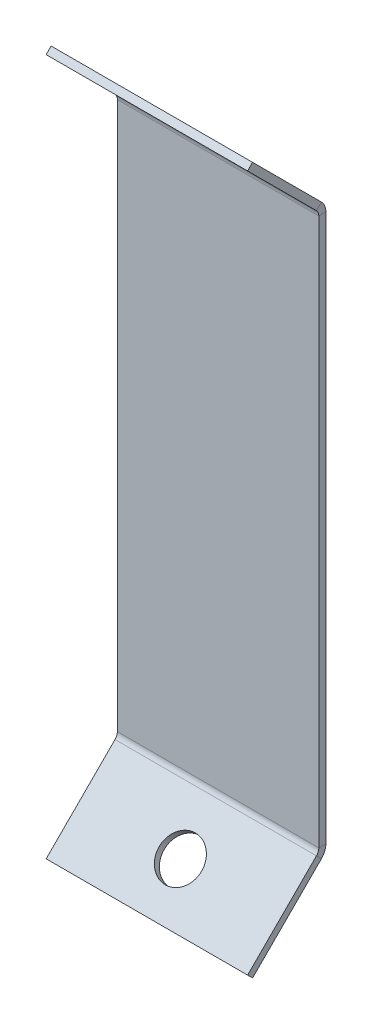
ISO-10303-21;
HEADER;
FILE_DESCRIPTION(('STEP AP214'),'2;1');
FILE_NAME('part.step','',(''),(''),'','','');
FILE_SCHEMA(('AUTOMOTIVE_DESIGN { 1 0 10303 214 1 1 1 1 }'));
ENDSEC;
DATA;
#1=APPLICATION_CONTEXT('core data for automotive mechanical design processes');
#2=APPLICATION_PROTOCOL_DEFINITION('international standard','automotive_design',2000,#1);
#3=PRODUCT_CONTEXT('',#1,'mechanical');
#4=PRODUCT('Part','Part','',(#3));
#5=PRODUCT_RELATED_PRODUCT_CATEGORY('part','',(#4));
#6=PRODUCT_DEFINITION_FORMATION('','',#4);
#7=PRODUCT_DEFINITION_CONTEXT('part definition',#1,'design');
#8=PRODUCT_DEFINITION('design','',#6,#7);
#9=PRODUCT_DEFINITION_SHAPE('','',#8);
#10=(LENGTH_UNIT() NAMED_UNIT(*) SI_UNIT(.MILLI.,.METRE.));
#11=(NAMED_UNIT(*) PLANE_ANGLE_UNIT() SI_UNIT($,.RADIAN.));
#12=(NAMED_UNIT(*) SI_UNIT($,.STERADIAN.) SOLID_ANGLE_UNIT());
#13=UNCERTAINTY_MEASURE_WITH_UNIT(LENGTH_MEASURE(1.E-05),#10,'distance_accuracy_value','');
#14=(GEOMETRIC_REPRESENTATION_CONTEXT(3) GLOBAL_UNCERTAINTY_ASSIGNED_CONTEXT((#13)) GLOBAL_UNIT_ASSIGNED_CONTEXT((#10,
#11,#12)) REPRESENTATION_CONTEXT('',''));
#15=CARTESIAN_POINT('',(0.,0.,0.));
#16=DIRECTION('',(0.,0.,1.));
#17=DIRECTION('',(1.,0.,0.));
#18=AXIS2_PLACEMENT_3D('',#15,#16,#17);
#19=CARTESIAN_POINT('',(0.,0.,-0.7));
#20=DIRECTION('',(0.,0.,-1.));
#21=DIRECTION('',(-1.,0.,0.));
#22=AXIS2_PLACEMENT_3D('',#19,#20,#21);
#23=PLANE('',#22);
#24=DIRECTION('',(0.,-1.,0.));
#25=VECTOR('',#24,1.);
#26=CARTESIAN_POINT('',(-10.,27.5,-0.7));
#27=LINE('',#26,#25);
#28=CARTESIAN_POINT('',(-10.,27.1686291501015,-0.699999999999997));
#29=VERTEX_POINT('',#28);
#30=CARTESIAN_POINT('',(-10.,-27.1686291501015,-0.7));
#31=VERTEX_POINT('',#30);
#32=EDGE_CURVE('E11',#29,#31,#27,.T.);
#33=ORIENTED_EDGE('',*,*,#32,.F.);
#34=DIRECTION('',(-1.,0.,0.));
#35=VECTOR('',#34,1.);
#36=CARTESIAN_POINT('',(-10.,27.1686291501015,-0.699999999999997));
#37=LINE('',#36,#35);
#38=CARTESIAN_POINT('',(9.99999999999999,27.1686291501015,-0.7));
#39=VERTEX_POINT('',#38);
#40=EDGE_CURVE('E203',#29,#39,#37,.F.);
#41=ORIENTED_EDGE('',*,*,#40,.T.);
#42=DIRECTION('',(0.,1.,0.));
#43=VECTOR('',#42,1.);
#44=CARTESIAN_POINT('',(10.,27.5,-0.7));
#45=LINE('',#44,#43);
#46=CARTESIAN_POINT('',(10.,-27.1686291501015,-0.7));
#47=VERTEX_POINT('',#46);
#48=EDGE_CURVE('E46',#47,#39,#45,.T.);
#49=ORIENTED_EDGE('',*,*,#48,.F.);
#50=DIRECTION('',(1.,0.,0.));
#51=VECTOR('',#50,1.);
#52=CARTESIAN_POINT('',(10.,-27.1686291501015,-0.7));
#53=LINE('',#52,#51);
#54=EDGE_CURVE('E60',#47,#31,#53,.F.);
#55=ORIENTED_EDGE('',*,*,#54,.T.);
#56=EDGE_LOOP('',(#33,#41,#49,#55));
#57=FACE_BOUND('',#56,.T.);
#58=ADVANCED_FACE('F37',(#57),#23,.T.);
#59=CARTESIAN_POINT('',(0.,0.,0.));
#60=DIRECTION('',(0.,0.,-1.));
#61=DIRECTION('',(-1.,0.,0.));
#62=AXIS2_PLACEMENT_3D('',#59,#60,#61);
#63=PLANE('',#62);
#64=DIRECTION('',(-1.,0.,0.));
#65=VECTOR('',#64,1.);
#66=CARTESIAN_POINT('',(-10.,27.1686291501015,0.));
#67=LINE('',#66,#65);
#68=CARTESIAN_POINT('',(-10.,27.1686291501015,0.));
#69=VERTEX_POINT('',#68);
#70=CARTESIAN_POINT('',(9.99999999999999,27.1686291501015,0.));
#71=VERTEX_POINT('',#70);
#72=EDGE_CURVE('E216',#69,#71,#67,.F.);
#73=ORIENTED_EDGE('',*,*,#72,.F.);
#74=DIRECTION('',(0.,-1.,0.));
#75=VECTOR('',#74,1.);
#76=CARTESIAN_POINT('',(-10.,27.5,0.));
#77=LINE('',#76,#75);
#78=CARTESIAN_POINT('',(-9.99999999999999,-27.1686291501015,0.));
#79=VERTEX_POINT('',#78);
#80=EDGE_CURVE('E149',#69,#79,#77,.T.);
#81=ORIENTED_EDGE('',*,*,#80,.T.);
#82=DIRECTION('',(1.,0.,0.));
#83=VECTOR('',#82,1.);
#84=CARTESIAN_POINT('',(10.,-27.1686291501015,0.));
#85=LINE('',#84,#83);
#86=CARTESIAN_POINT('',(10.,-27.1686291501015,0.));
#87=VERTEX_POINT('',#86);
#88=EDGE_CURVE('E104',#87,#79,#85,.F.);
#89=ORIENTED_EDGE('',*,*,#88,.F.);
#90=DIRECTION('',(0.,1.,0.));
#91=VECTOR('',#90,1.);
#92=CARTESIAN_POINT('',(10.,27.5,0.));
#93=LINE('',#92,#91);
#94=EDGE_CURVE('E146',#87,#71,#93,.T.);
#95=ORIENTED_EDGE('',*,*,#94,.T.);
#96=EDGE_LOOP('',(#73,#81,#89,#95));
#97=FACE_BOUND('',#96,.T.);
#98=ADVANCED_FACE('F325',(#97),#63,.F.);
#99=CARTESIAN_POINT('',(-10.,27.5,-0.7));
#100=DIRECTION('',(-1.,0.,0.));
#101=DIRECTION('',(0.,-1.,0.));
#102=AXIS2_PLACEMENT_3D('',#99,#100,#101);
#103=PLANE('',#102);
#104=ORIENTED_EDGE('',*,*,#80,.F.);
#105=DIRECTION('',(0.,0.,-1.));
#106=VECTOR('',#105,1.);
#107=CARTESIAN_POINT('',(-10.,27.1686291501015,0.));
#108=LINE('',#107,#106);
#109=EDGE_CURVE('E210',#69,#29,#108,.T.);
#110=ORIENTED_EDGE('',*,*,#109,.T.);
#111=ORIENTED_EDGE('',*,*,#32,.T.);
#112=DIRECTION('',(0.,0.,-1.));
#113=VECTOR('',#112,1.);
#114=CARTESIAN_POINT('',(-9.99999999999999,-27.1686291501015,0.));
#115=LINE('',#114,#113);
#116=EDGE_CURVE('E143',#79,#31,#115,.T.);
#117=ORIENTED_EDGE('',*,*,#116,.F.);
#118=EDGE_LOOP('',(#104,#110,#111,#117));
#119=FACE_BOUND('',#118,.T.);
#120=ADVANCED_FACE('F331',(#119),#103,.T.);
#121=CARTESIAN_POINT('',(10.,27.5,-0.7));
#122=DIRECTION('',(1.,0.,0.));
#123=DIRECTION('',(0.,1.,0.));
#124=AXIS2_PLACEMENT_3D('',#121,#122,#123);
#125=PLANE('',#124);
#126=DIRECTION('',(0.,0.,-1.));
#127=VECTOR('',#126,1.);
#128=CARTESIAN_POINT('',(9.99999999999999,27.1686291501015,0.));
#129=LINE('',#128,#127);
#130=EDGE_CURVE('E221',#71,#39,#129,.T.);
#131=ORIENTED_EDGE('',*,*,#130,.F.);
#132=ORIENTED_EDGE('',*,*,#94,.F.);
#133=DIRECTION('',(0.,0.,-1.));
#134=VECTOR('',#133,1.);
#135=CARTESIAN_POINT('',(10.,-27.1686291501015,0.));
#136=LINE('',#135,#134);
#137=EDGE_CURVE('E103',#87,#47,#136,.T.);
#138=ORIENTED_EDGE('',*,*,#137,.T.);
#139=ORIENTED_EDGE('',*,*,#48,.T.);
#140=EDGE_LOOP('',(#131,#132,#138,#139));
#141=FACE_BOUND('',#140,.T.);
#142=ADVANCED_FACE('F39',(#141),#125,.T.);
#143=CARTESIAN_POINT('',(-9.99999999999999,-27.1686291501015,0.800000000000001));
#144=DIRECTION('',(-1.,0.,0.));
#145=DIRECTION('',(0.,0.,1.));
#146=AXIS2_PLACEMENT_3D('',#143,#144,#145);
#147=PLANE('',#146);
#148=DIRECTION('',(0.,-0.707106781186544,-0.707106781186551));
#149=VECTOR('',#148,1.);
#150=CARTESIAN_POINT('',(-10.,-27.7343145750508,0.23431457505076));
#151=LINE('',#150,#149);
#152=CARTESIAN_POINT('',(-9.99999999999999,-27.7343145750508,0.234314575050759));
#153=VERTEX_POINT('',#152);
#154=CARTESIAN_POINT('',(-9.99999999999999,-28.2292893218813,-0.260660171779827));
#155=VERTEX_POINT('',#154);
#156=EDGE_CURVE('E94',#153,#155,#151,.T.);
#157=ORIENTED_EDGE('',*,*,#156,.F.);
#158=CARTESIAN_POINT('',(-9.99999999999999,-27.1686291501015,0.800000000000001));
#159=DIRECTION('',(1.,0.,0.));
#160=DIRECTION('',(0.,0.,-1.));
#161=AXIS2_PLACEMENT_3D('',#158,#159,#160);
#162=CIRCLE('',#161,0.800000000000001);
#163=EDGE_CURVE('E88',#79,#153,#162,.F.);
#164=ORIENTED_EDGE('',*,*,#163,.F.);
#165=ORIENTED_EDGE('',*,*,#116,.T.);
#166=CARTESIAN_POINT('',(-9.99999999999999,-27.1686291501015,0.800000000000001));
#167=DIRECTION('',(1.,0.,0.));
#168=DIRECTION('',(0.,0.,-1.));
#169=AXIS2_PLACEMENT_3D('',#166,#167,#168);
#170=CIRCLE('',#169,1.5);
#171=EDGE_CURVE('E136',#31,#155,#170,.F.);
#172=ORIENTED_EDGE('',*,*,#171,.T.);
#173=EDGE_LOOP('',(#157,#164,#165,#172));
#174=FACE_BOUND('',#173,.T.);
#175=ADVANCED_FACE('F244',(#174),#147,.T.);
#176=CARTESIAN_POINT('',(10.,-27.1686291501015,0.800000000000001));
#177=DIRECTION('',(-1.,0.,0.));
#178=DIRECTION('',(0.,0.,1.));
#179=AXIS2_PLACEMENT_3D('',#176,#177,#178);
#180=PLANE('',#179);
#181=CARTESIAN_POINT('',(10.,-27.1686291501015,0.800000000000001));
#182=DIRECTION('',(1.,0.,0.));
#183=DIRECTION('',(0.,0.,-1.));
#184=AXIS2_PLACEMENT_3D('',#181,#182,#183);
#185=CIRCLE('',#184,0.800000000000001);
#186=CARTESIAN_POINT('',(10.,-27.7343145750508,0.234314575050759));
#187=VERTEX_POINT('',#186);
#188=EDGE_CURVE('E85',#187,#87,#185,.T.);
#189=ORIENTED_EDGE('',*,*,#188,.F.);
#190=DIRECTION('',(0.,-0.707106781186544,-0.707106781186551));
#191=VECTOR('',#190,1.);
#192=CARTESIAN_POINT('',(10.,-27.7343145750508,0.23431457505076));
#193=LINE('',#192,#191);
#194=CARTESIAN_POINT('',(10.,-28.2292893218813,-0.260660171779825));
#195=VERTEX_POINT('',#194);
#196=EDGE_CURVE('E93',#187,#195,#193,.T.);
#197=ORIENTED_EDGE('',*,*,#196,.T.);
#198=CARTESIAN_POINT('',(10.,-27.1686291501015,0.800000000000001));
#199=DIRECTION('',(1.,0.,0.));
#200=DIRECTION('',(0.,0.,-1.));
#201=AXIS2_PLACEMENT_3D('',#198,#199,#200);
#202=CIRCLE('',#201,1.5);
#203=EDGE_CURVE('E137',#195,#47,#202,.T.);
#204=ORIENTED_EDGE('',*,*,#203,.T.);
#205=ORIENTED_EDGE('',*,*,#137,.F.);
#206=EDGE_LOOP('',(#189,#197,#204,#205));
#207=FACE_BOUND('',#206,.T.);
#208=ADVANCED_FACE('F99',(#207),#180,.F.);
#209=CARTESIAN_POINT('',(10.,-27.1686291501015,0.800000000000001));
#210=DIRECTION('',(1.,0.,0.));
#211=DIRECTION('',(0.,-0.707106781186544,-0.707106781186551));
#212=AXIS2_PLACEMENT_3D('',#209,#210,#211);
#213=CYLINDRICAL_SURFACE('',#212,1.5);
#214=ORIENTED_EDGE('',*,*,#54,.F.);
#215=ORIENTED_EDGE('',*,*,#203,.F.);
#216=DIRECTION('',(-1.,0.,0.));
#217=VECTOR('',#216,1.);
#218=CARTESIAN_POINT('',(0.,-28.2292893218813,-0.260660171779822));
#219=LINE('',#218,#217);
#220=EDGE_CURVE('E117',#195,#155,#219,.T.);
#221=ORIENTED_EDGE('',*,*,#220,.T.);
#222=ORIENTED_EDGE('',*,*,#171,.F.);
#223=EDGE_LOOP('',(#214,#215,#221,#222));
#224=FACE_BOUND('',#223,.T.);
#225=ADVANCED_FACE('F245',(#224),#213,.T.);
#226=CARTESIAN_POINT('',(10.,-27.1686291501015,0.800000000000001));
#227=DIRECTION('',(1.,0.,0.));
#228=DIRECTION('',(0.,-0.707106781186544,-0.707106781186551));
#229=AXIS2_PLACEMENT_3D('',#226,#227,#228);
#230=CYLINDRICAL_SURFACE('',#229,0.800000000000001);
#231=ORIENTED_EDGE('',*,*,#88,.T.);
#232=ORIENTED_EDGE('',*,*,#163,.T.);
#233=DIRECTION('',(1.,0.,0.));
#234=VECTOR('',#233,1.);
#235=CARTESIAN_POINT('',(-10.,-27.7343145750508,0.23431457505076));
#236=LINE('',#235,#234);
#237=EDGE_CURVE('E81',#153,#187,#236,.T.);
#238=ORIENTED_EDGE('',*,*,#237,.T.);
#239=ORIENTED_EDGE('',*,*,#188,.T.);
#240=EDGE_LOOP('',(#231,#232,#238,#239));
#241=FACE_BOUND('',#240,.T.);
#242=ADVANCED_FACE('F84',(#241),#230,.F.);
#243=CARTESIAN_POINT('',(-10.,-27.9949747468306,-0.494974746830586));
#244=DIRECTION('',(1.,0.,0.));
#245=DIRECTION('',(0.,0.,-1.));
#246=AXIS2_PLACEMENT_3D('',#243,#244,#245);
#247=PLANE('',#246);
#248=ORIENTED_EDGE('',*,*,#156,.T.);
#249=DIRECTION('',(0.,0.707106781186551,-0.707106781186544));
#250=VECTOR('',#249,1.);
#251=CARTESIAN_POINT('',(-10.,-27.9949747468306,-0.494974746830586));
#252=LINE('',#251,#250);
#253=CARTESIAN_POINT('',(-10.,-35.0660425586961,6.57609306503485));
#254=VERTEX_POINT('',#253);
#255=EDGE_CURVE('E125',#254,#155,#252,.T.);
#256=ORIENTED_EDGE('',*,*,#255,.F.);
#257=DIRECTION('',(0.,0.707106781186544,0.707106781186551));
#258=VECTOR('',#257,1.);
#259=CARTESIAN_POINT('',(-10.,-35.0660425586961,6.57609306503485));
#260=LINE('',#259,#258);
#261=CARTESIAN_POINT('',(-10.,-34.5710678118655,7.07106781186544));
#262=VERTEX_POINT('',#261);
#263=EDGE_CURVE('E130',#254,#262,#260,.T.);
#264=ORIENTED_EDGE('',*,*,#263,.T.);
#265=DIRECTION('',(0.,0.707106781186551,-0.707106781186544));
#266=VECTOR('',#265,1.);
#267=CARTESIAN_POINT('',(-10.,-27.5,0.));
#268=LINE('',#267,#266);
#269=EDGE_CURVE('E123',#262,#153,#268,.T.);
#270=ORIENTED_EDGE('',*,*,#269,.T.);
#271=EDGE_LOOP('',(#248,#256,#264,#270));
#272=FACE_BOUND('',#271,.T.);
#273=ADVANCED_FACE('F242',(#272),#247,.F.);
#274=CARTESIAN_POINT('',(10.,-35.0660425586961,6.57609306503485));
#275=DIRECTION('',(-1.,0.,0.));
#276=DIRECTION('',(0.,0.,1.));
#277=AXIS2_PLACEMENT_3D('',#274,#275,#276);
#278=PLANE('',#277);
#279=ORIENTED_EDGE('',*,*,#196,.F.);
#280=DIRECTION('',(0.,-0.707106781186551,0.707106781186544));
#281=VECTOR('',#280,1.);
#282=CARTESIAN_POINT('',(10.,-34.5710678118655,7.07106781186544));
#283=LINE('',#282,#281);
#284=CARTESIAN_POINT('',(10.,-34.5710678118655,7.07106781186544));
#285=VERTEX_POINT('',#284);
#286=EDGE_CURVE('E113',#187,#285,#283,.T.);
#287=ORIENTED_EDGE('',*,*,#286,.T.);
#288=DIRECTION('',(0.,0.707106781186544,0.707106781186551));
#289=VECTOR('',#288,1.);
#290=CARTESIAN_POINT('',(10.,-35.0660425586961,6.57609306503485));
#291=LINE('',#290,#289);
#292=CARTESIAN_POINT('',(10.,-35.0660425586961,6.57609306503485));
#293=VERTEX_POINT('',#292);
#294=EDGE_CURVE('E105',#293,#285,#291,.T.);
#295=ORIENTED_EDGE('',*,*,#294,.F.);
#296=DIRECTION('',(0.,-0.707106781186551,0.707106781186544));
#297=VECTOR('',#296,1.);
#298=CARTESIAN_POINT('',(10.,-35.0660425586961,6.57609306503485));
#299=LINE('',#298,#297);
#300=EDGE_CURVE('E116',#195,#293,#299,.T.);
#301=ORIENTED_EDGE('',*,*,#300,.F.);
#302=EDGE_LOOP('',(#279,#287,#295,#301));
#303=FACE_BOUND('',#302,.T.);
#304=ADVANCED_FACE('F110',(#303),#278,.F.);
#305=CARTESIAN_POINT('',(0.,-14.2449747468304,-14.2449747468306));
#306=DIRECTION('',(0.,0.707106781186544,0.707106781186551));
#307=DIRECTION('',(0.,-0.707106781186551,0.707106781186544));
#308=AXIS2_PLACEMENT_3D('',#305,#306,#307);
#309=PLANE('',#308);
#310=CARTESIAN_POINT('',(0.,-31.7379292135304,3.2479797198692));
#311=DIRECTION('',(0.,0.707106781186544,0.707106781186551));
#312=DIRECTION('',(0.,-0.707106781186551,0.707106781186544));
#313=AXIS2_PLACEMENT_3D('',#310,#311,#312);
#314=CIRCLE('',#313,2.1082);
#315=CARTESIAN_POINT('',(0.,-33.2286517296279,4.73870223596667));
#316=VERTEX_POINT('',#315);
#317=EDGE_CURVE('E153',#316,#316,#314,.T.);
#318=ORIENTED_EDGE('',*,*,#317,.T.);
#319=EDGE_LOOP('',(#318));
#320=FACE_BOUND('',#319,.T.);
#321=ORIENTED_EDGE('',*,*,#220,.F.);
#322=ORIENTED_EDGE('',*,*,#300,.T.);
#323=DIRECTION('',(-1.,0.,0.));
#324=VECTOR('',#323,1.);
#325=CARTESIAN_POINT('',(-10.,-35.0660425586961,6.57609306503485));
#326=LINE('',#325,#324);
#327=EDGE_CURVE('E133',#293,#254,#326,.T.);
#328=ORIENTED_EDGE('',*,*,#327,.T.);
#329=ORIENTED_EDGE('',*,*,#255,.T.);
#330=EDGE_LOOP('',(#321,#322,#328,#329));
#331=FACE_BOUND('',#330,.T.);
#332=ADVANCED_FACE('F234',(#320,#331),#309,.F.);
#333=CARTESIAN_POINT('',(0.,-13.7499999999999,-13.75));
#334=DIRECTION('',(0.,0.707106781186544,0.707106781186551));
#335=DIRECTION('',(0.,-0.707106781186551,0.707106781186544));
#336=AXIS2_PLACEMENT_3D('',#333,#334,#335);
#337=PLANE('',#336);
#338=CARTESIAN_POINT('',(0.,-31.2429544666998,3.74295446669978));
#339=DIRECTION('',(0.,0.707106781186544,0.707106781186551));
#340=DIRECTION('',(0.,-0.707106781186551,0.707106781186544));
#341=AXIS2_PLACEMENT_3D('',#338,#339,#340);
#342=CIRCLE('',#341,2.1082);
#343=CARTESIAN_POINT('',(0.,-32.7336769827973,5.23367698279725));
#344=VERTEX_POINT('',#343);
#345=EDGE_CURVE('E156',#344,#344,#342,.T.);
#346=ORIENTED_EDGE('',*,*,#345,.F.);
#347=EDGE_LOOP('',(#346));
#348=FACE_BOUND('',#347,.T.);
#349=ORIENTED_EDGE('',*,*,#286,.F.);
#350=ORIENTED_EDGE('',*,*,#237,.F.);
#351=ORIENTED_EDGE('',*,*,#269,.F.);
#352=DIRECTION('',(-1.,0.,0.));
#353=VECTOR('',#352,1.);
#354=CARTESIAN_POINT('',(-10.,-34.5710678118655,7.07106781186544));
#355=LINE('',#354,#353);
#356=EDGE_CURVE('E122',#285,#262,#355,.T.);
#357=ORIENTED_EDGE('',*,*,#356,.F.);
#358=EDGE_LOOP('',(#349,#350,#351,#357));
#359=FACE_BOUND('',#358,.T.);
#360=ADVANCED_FACE('F120',(#348,#359),#337,.T.);
#361=CARTESIAN_POINT('',(-10.,-35.0660425586961,6.57609306503485));
#362=DIRECTION('',(0.,0.707106781186551,-0.707106781186544));
#363=DIRECTION('',(0.,0.707106781186544,0.707106781186551));
#364=AXIS2_PLACEMENT_3D('',#361,#362,#363);
#365=PLANE('',#364);
#366=ORIENTED_EDGE('',*,*,#356,.T.);
#367=ORIENTED_EDGE('',*,*,#263,.F.);
#368=ORIENTED_EDGE('',*,*,#327,.F.);
#369=ORIENTED_EDGE('',*,*,#294,.T.);
#370=EDGE_LOOP('',(#366,#367,#368,#369));
#371=FACE_BOUND('',#370,.T.);
#372=ADVANCED_FACE('F239',(#371),#365,.F.);
#373=CARTESIAN_POINT('',(9.99999999999999,27.1686291501015,0.799999999999997));
#374=DIRECTION('',(1.,0.,0.));
#375=DIRECTION('',(0.,0.,-1.));
#376=AXIS2_PLACEMENT_3D('',#373,#374,#375);
#377=PLANE('',#376);
#378=DIRECTION('',(0.,0.707106781186544,-0.707106781186551));
#379=VECTOR('',#378,1.);
#380=CARTESIAN_POINT('',(9.99999999999999,27.7343145750508,0.234314575050756));
#381=LINE('',#380,#379);
#382=CARTESIAN_POINT('',(9.99999999999999,27.7343145750508,0.234314575050754));
#383=VERTEX_POINT('',#382);
#384=CARTESIAN_POINT('',(9.99999999999998,28.2292893218813,-0.260660171779833));
#385=VERTEX_POINT('',#384);
#386=EDGE_CURVE('E155',#383,#385,#381,.T.);
#387=ORIENTED_EDGE('',*,*,#386,.F.);
#388=CARTESIAN_POINT('',(9.99999999999999,27.1686291501015,0.799999999999997));
#389=DIRECTION('',(-1.,0.,0.));
#390=DIRECTION('',(0.,0.,1.));
#391=AXIS2_PLACEMENT_3D('',#388,#389,#390);
#392=CIRCLE('',#391,0.800000000000002);
#393=EDGE_CURVE('E213',#71,#383,#392,.F.);
#394=ORIENTED_EDGE('',*,*,#393,.F.);
#395=ORIENTED_EDGE('',*,*,#130,.T.);
#396=CARTESIAN_POINT('',(9.99999999999998,27.1686291501015,0.799999999999997));
#397=DIRECTION('',(-1.,0.,0.));
#398=DIRECTION('',(0.,0.,1.));
#399=AXIS2_PLACEMENT_3D('',#396,#397,#398);
#400=CIRCLE('',#399,1.5);
#401=EDGE_CURVE('E206',#39,#385,#400,.F.);
#402=ORIENTED_EDGE('',*,*,#401,.T.);
#403=EDGE_LOOP('',(#387,#394,#395,#402));
#404=FACE_BOUND('',#403,.T.);
#405=ADVANCED_FACE('F303',(#404),#377,.T.);
#406=CARTESIAN_POINT('',(-10.,27.1686291501015,0.800000000000006));
#407=DIRECTION('',(1.,0.,0.));
#408=DIRECTION('',(0.,0.,-1.));
#409=AXIS2_PLACEMENT_3D('',#406,#407,#408);
#410=PLANE('',#409);
#411=CARTESIAN_POINT('',(-10.,27.1686291501015,0.800000000000006));
#412=DIRECTION('',(-1.,0.,0.));
#413=DIRECTION('',(0.,0.,1.));
#414=AXIS2_PLACEMENT_3D('',#411,#412,#413);
#415=CIRCLE('',#414,0.800000000000002);
#416=CARTESIAN_POINT('',(-10.,27.7343145750508,0.234314575050763));
#417=VERTEX_POINT('',#416);
#418=EDGE_CURVE('E202',#417,#69,#415,.T.);
#419=ORIENTED_EDGE('',*,*,#418,.F.);
#420=DIRECTION('',(0.,0.707106781186544,-0.707106781186551));
#421=VECTOR('',#420,1.);
#422=CARTESIAN_POINT('',(-10.,27.7343145750508,0.234314575050763));
#423=LINE('',#422,#421);
#424=CARTESIAN_POINT('',(-10.,28.2292893218813,-0.260660171779829));
#425=VERTEX_POINT('',#424);
#426=EDGE_CURVE('E172',#417,#425,#423,.T.);
#427=ORIENTED_EDGE('',*,*,#426,.T.);
#428=CARTESIAN_POINT('',(-10.,27.1686291501015,0.800000000000006));
#429=DIRECTION('',(-1.,0.,0.));
#430=DIRECTION('',(0.,0.,1.));
#431=AXIS2_PLACEMENT_3D('',#428,#429,#430);
#432=CIRCLE('',#431,1.5);
#433=EDGE_CURVE('E207',#425,#29,#432,.T.);
#434=ORIENTED_EDGE('',*,*,#433,.T.);
#435=ORIENTED_EDGE('',*,*,#109,.F.);
#436=EDGE_LOOP('',(#419,#427,#434,#435));
#437=FACE_BOUND('',#436,.T.);
#438=ADVANCED_FACE('F284',(#437),#410,.F.);
#439=CARTESIAN_POINT('',(-10.,27.1686291501015,0.800000000000006));
#440=DIRECTION('',(-1.,0.,0.));
#441=DIRECTION('',(0.,0.707106781186544,-0.707106781186551));
#442=AXIS2_PLACEMENT_3D('',#439,#440,#441);
#443=CYLINDRICAL_SURFACE('',#442,1.5);
#444=ORIENTED_EDGE('',*,*,#40,.F.);
#445=ORIENTED_EDGE('',*,*,#433,.F.);
#446=DIRECTION('',(1.,0.,0.));
#447=VECTOR('',#446,1.);
#448=CARTESIAN_POINT('',(0.,28.2292893218813,-0.260660171779831));
#449=LINE('',#448,#447);
#450=EDGE_CURVE('E174',#425,#385,#449,.T.);
#451=ORIENTED_EDGE('',*,*,#450,.T.);
#452=ORIENTED_EDGE('',*,*,#401,.F.);
#453=EDGE_LOOP('',(#444,#445,#451,#452));
#454=FACE_BOUND('',#453,.T.);
#455=ADVANCED_FACE('F279',(#454),#443,.T.);
#456=CARTESIAN_POINT('',(-10.,27.1686291501015,0.800000000000006));
#457=DIRECTION('',(-1.,0.,0.));
#458=DIRECTION('',(0.,0.707106781186544,-0.707106781186551));
#459=AXIS2_PLACEMENT_3D('',#456,#457,#458);
#460=CYLINDRICAL_SURFACE('',#459,0.800000000000002);
#461=ORIENTED_EDGE('',*,*,#72,.T.);
#462=ORIENTED_EDGE('',*,*,#393,.T.);
#463=DIRECTION('',(-1.,0.,0.));
#464=VECTOR('',#463,1.);
#465=CARTESIAN_POINT('',(9.99999999999999,27.7343145750508,0.234314575050756));
#466=LINE('',#465,#464);
#467=EDGE_CURVE('E160',#383,#417,#466,.T.);
#468=ORIENTED_EDGE('',*,*,#467,.T.);
#469=ORIENTED_EDGE('',*,*,#418,.T.);
#470=EDGE_LOOP('',(#461,#462,#468,#469));
#471=FACE_BOUND('',#470,.T.);
#472=ADVANCED_FACE('F307',(#471),#460,.F.);
#473=CARTESIAN_POINT('',(-10.,35.0660425586961,6.57609306503485));
#474=DIRECTION('',(1.,0.,0.));
#475=DIRECTION('',(0.,1.,0.));
#476=AXIS2_PLACEMENT_3D('',#473,#474,#475);
#477=PLANE('',#476);
#478=ORIENTED_EDGE('',*,*,#426,.F.);
#479=DIRECTION('',(0.,0.707106781186551,0.707106781186544));
#480=VECTOR('',#479,1.);
#481=CARTESIAN_POINT('',(-10.,34.5710678118655,7.07106781186544));
#482=LINE('',#481,#480);
#483=CARTESIAN_POINT('',(-10.,34.5710678118655,7.07106781186544));
#484=VERTEX_POINT('',#483);
#485=EDGE_CURVE('E178',#417,#484,#482,.T.);
#486=ORIENTED_EDGE('',*,*,#485,.T.);
#487=DIRECTION('',(0.,-0.707106781186544,0.707106781186551));
#488=VECTOR('',#487,1.);
#489=CARTESIAN_POINT('',(-10.,35.0660425586961,6.57609306503485));
#490=LINE('',#489,#488);
#491=CARTESIAN_POINT('',(-10.,35.0660425586961,6.57609306503485));
#492=VERTEX_POINT('',#491);
#493=EDGE_CURVE('E199',#492,#484,#490,.T.);
#494=ORIENTED_EDGE('',*,*,#493,.F.);
#495=DIRECTION('',(0.,0.707106781186551,0.707106781186544));
#496=VECTOR('',#495,1.);
#497=CARTESIAN_POINT('',(-10.,35.0660425586961,6.57609306503485));
#498=LINE('',#497,#496);
#499=EDGE_CURVE('E179',#425,#492,#498,.T.);
#500=ORIENTED_EDGE('',*,*,#499,.F.);
#501=EDGE_LOOP('',(#478,#486,#494,#500));
#502=FACE_BOUND('',#501,.T.);
#503=ADVANCED_FACE('F292',(#502),#477,.F.);
#504=CARTESIAN_POINT('',(10.,27.9949747468306,-0.494974746830586));
#505=DIRECTION('',(-1.,0.,0.));
#506=DIRECTION('',(0.,-1.,0.));
#507=AXIS2_PLACEMENT_3D('',#504,#505,#506);
#508=PLANE('',#507);
#509=ORIENTED_EDGE('',*,*,#386,.T.);
#510=DIRECTION('',(0.,-0.707106781186551,-0.707106781186544));
#511=VECTOR('',#510,1.);
#512=CARTESIAN_POINT('',(10.,27.9949747468306,-0.494974746830586));
#513=LINE('',#512,#511);
#514=CARTESIAN_POINT('',(9.99999999999999,35.0660425586961,6.57609306503485));
#515=VERTEX_POINT('',#514);
#516=EDGE_CURVE('E186',#515,#385,#513,.T.);
#517=ORIENTED_EDGE('',*,*,#516,.F.);
#518=DIRECTION('',(0.,-0.707106781186544,0.707106781186551));
#519=VECTOR('',#518,1.);
#520=CARTESIAN_POINT('',(9.99999999999999,35.0660425586961,6.57609306503485));
#521=LINE('',#520,#519);
#522=CARTESIAN_POINT('',(9.99999999999999,34.5710678118655,7.07106781186544));
#523=VERTEX_POINT('',#522);
#524=EDGE_CURVE('E189',#515,#523,#521,.T.);
#525=ORIENTED_EDGE('',*,*,#524,.T.);
#526=DIRECTION('',(0.,-0.707106781186551,-0.707106781186544));
#527=VECTOR('',#526,1.);
#528=CARTESIAN_POINT('',(10.,27.5,0.));
#529=LINE('',#528,#527);
#530=EDGE_CURVE('E183',#523,#383,#529,.T.);
#531=ORIENTED_EDGE('',*,*,#530,.T.);
#532=EDGE_LOOP('',(#509,#517,#525,#531));
#533=FACE_BOUND('',#532,.T.);
#534=ADVANCED_FACE('F300',(#533),#508,.F.);
#535=CARTESIAN_POINT('',(0.,14.2449747468304,-14.2449747468306));
#536=DIRECTION('',(0.,-0.707106781186544,0.707106781186551));
#537=DIRECTION('',(0.,-0.707106781186551,-0.707106781186544));
#538=AXIS2_PLACEMENT_3D('',#535,#536,#537);
#539=PLANE('',#538);
#540=CARTESIAN_POINT('',(0.,31.880333762695,3.39038426903379));
#541=DIRECTION('',(0.,-0.707106781186544,0.707106781186551));
#542=DIRECTION('',(0.,-0.707106781186551,-0.707106781186544));
#543=AXIS2_PLACEMENT_3D('',#540,#541,#542);
#544=CIRCLE('',#543,2.1082);
#545=CARTESIAN_POINT('',(0.,30.3896112465975,1.89966175293631));
#546=VERTEX_POINT('',#545);
#547=EDGE_CURVE('E41',#546,#546,#544,.T.);
#548=ORIENTED_EDGE('',*,*,#547,.T.);
#549=EDGE_LOOP('',(#548));
#550=FACE_BOUND('',#549,.T.);
#551=ORIENTED_EDGE('',*,*,#450,.F.);
#552=ORIENTED_EDGE('',*,*,#499,.T.);
#553=DIRECTION('',(1.,0.,0.));
#554=VECTOR('',#553,1.);
#555=CARTESIAN_POINT('',(9.99999999999999,35.0660425586961,6.57609306503485));
#556=LINE('',#555,#554);
#557=EDGE_CURVE('E182',#492,#515,#556,.T.);
#558=ORIENTED_EDGE('',*,*,#557,.T.);
#559=ORIENTED_EDGE('',*,*,#516,.T.);
#560=EDGE_LOOP('',(#551,#552,#558,#559));
#561=FACE_BOUND('',#560,.T.);
#562=ADVANCED_FACE('F289',(#550,#561),#539,.F.);
#563=CARTESIAN_POINT('',(0.,13.7499999999999,-13.75));
#564=DIRECTION('',(0.,-0.707106781186544,0.707106781186551));
#565=DIRECTION('',(0.,-0.707106781186551,-0.707106781186544));
#566=AXIS2_PLACEMENT_3D('',#563,#564,#565);
#567=PLANE('',#566);
#568=CARTESIAN_POINT('',(0.,31.3853590158644,3.88535901586438));
#569=DIRECTION('',(0.,-0.707106781186544,0.707106781186551));
#570=DIRECTION('',(0.,-0.707106781186551,-0.707106781186544));
#571=AXIS2_PLACEMENT_3D('',#568,#569,#570);
#572=CIRCLE('',#571,2.1082);
#573=CARTESIAN_POINT('',(0.,29.8946364997669,2.3946364997669));
#574=VERTEX_POINT('',#573);
#575=EDGE_CURVE('E167',#574,#574,#572,.T.);
#576=ORIENTED_EDGE('',*,*,#575,.F.);
#577=EDGE_LOOP('',(#576));
#578=FACE_BOUND('',#577,.T.);
#579=ORIENTED_EDGE('',*,*,#485,.F.);
#580=ORIENTED_EDGE('',*,*,#467,.F.);
#581=ORIENTED_EDGE('',*,*,#530,.F.);
#582=DIRECTION('',(1.,0.,0.));
#583=VECTOR('',#582,1.);
#584=CARTESIAN_POINT('',(9.99999999999999,34.5710678118655,7.07106781186544));
#585=LINE('',#584,#583);
#586=EDGE_CURVE('E192',#484,#523,#585,.T.);
#587=ORIENTED_EDGE('',*,*,#586,.F.);
#588=EDGE_LOOP('',(#579,#580,#581,#587));
#589=FACE_BOUND('',#588,.T.);
#590=ADVANCED_FACE('F310',(#578,#589),#567,.T.);
#591=CARTESIAN_POINT('',(9.99999999999999,35.0660425586961,6.57609306503485));
#592=DIRECTION('',(0.,-0.707106781186551,-0.707106781186544));
#593=DIRECTION('',(0.,0.707106781186544,-0.707106781186551));
#594=AXIS2_PLACEMENT_3D('',#591,#592,#593);
#595=PLANE('',#594);
#596=ORIENTED_EDGE('',*,*,#586,.T.);
#597=ORIENTED_EDGE('',*,*,#524,.F.);
#598=ORIENTED_EDGE('',*,*,#557,.F.);
#599=ORIENTED_EDGE('',*,*,#493,.T.);
#600=EDGE_LOOP('',(#596,#597,#598,#599));
#601=FACE_BOUND('',#600,.T.);
#602=ADVANCED_FACE('F297',(#601),#595,.F.);
#603=CARTESIAN_POINT('',(0.,-31.2429544666998,3.74295446669978));
#604=DIRECTION('',(0.,0.707106781186544,0.707106781186551));
#605=DIRECTION('',(0.,-0.707106781186551,0.707106781186544));
#606=AXIS2_PLACEMENT_3D('',#603,#604,#605);
#607=CYLINDRICAL_SURFACE('',#606,2.1082);
#608=ORIENTED_EDGE('',*,*,#345,.T.);
#609=EDGE_LOOP('',(#608));
#610=FACE_BOUND('',#609,.T.);
#611=ORIENTED_EDGE('',*,*,#317,.F.);
#612=EDGE_LOOP('',(#611));
#613=FACE_BOUND('',#612,.T.);
#614=ADVANCED_FACE('F318',(#610,#613),#607,.F.);
#615=CARTESIAN_POINT('',(0.,31.3853590158644,3.88535901586438));
#616=DIRECTION('',(0.,-0.707106781186544,0.707106781186551));
#617=DIRECTION('',(0.,-0.707106781186551,-0.707106781186544));
#618=AXIS2_PLACEMENT_3D('',#615,#616,#617);
#619=CYLINDRICAL_SURFACE('',#618,2.1082);
#620=ORIENTED_EDGE('',*,*,#575,.T.);
#621=EDGE_LOOP('',(#620));
#622=FACE_BOUND('',#621,.T.);
#623=ORIENTED_EDGE('',*,*,#547,.F.);
#624=EDGE_LOOP('',(#623));
#625=FACE_BOUND('',#624,.T.);
#626=ADVANCED_FACE('F402',(#622,#625),#619,.F.);
#627=CLOSED_SHELL('',(#58,#98,#120,#142,#175,#208,#225,#242,#273,#304,#332,#360,#372,#405,#438,
#455,#472,#503,#534,#562,#590,#602,#614,#626));
#628=MANIFOLD_SOLID_BREP('B2',#627);
#629=ADVANCED_BREP_SHAPE_REPRESENTATION('',(#18,#628),#14);
#630=SHAPE_DEFINITION_REPRESENTATION(#9,#629);
ENDSEC;
END-ISO-10303-21;
